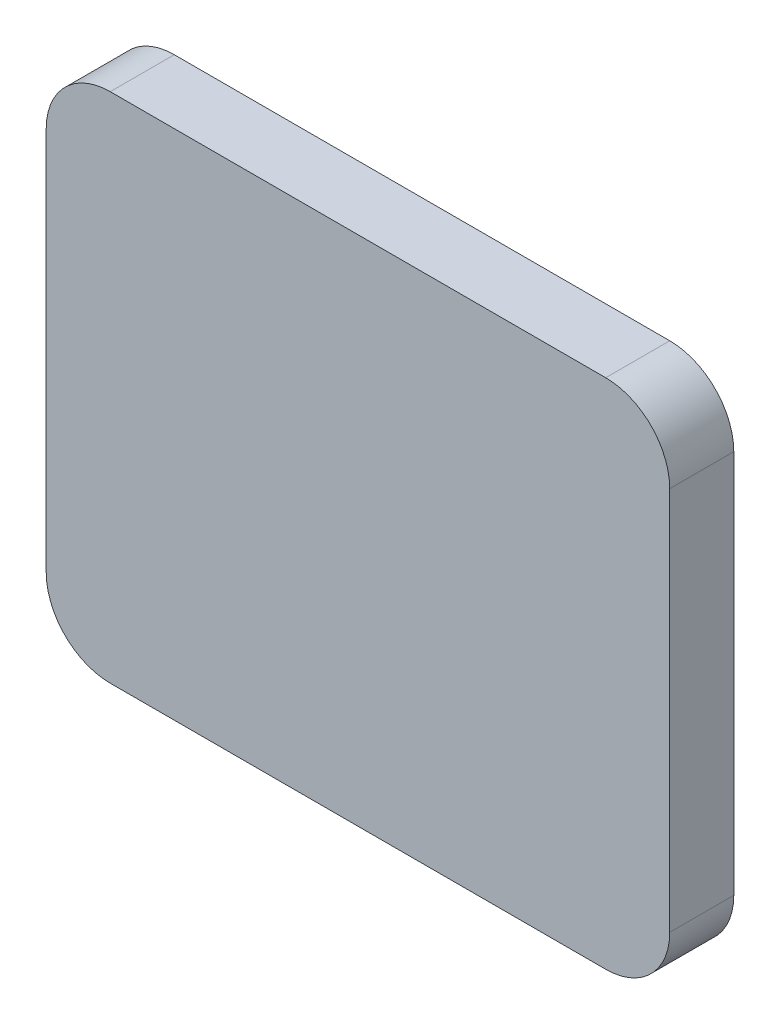
ISO-10303-21;
HEADER;
FILE_DESCRIPTION(('STEP AP214'),'2;1');
FILE_NAME('part.step','',(''),(''),'','','');
FILE_SCHEMA(('AUTOMOTIVE_DESIGN { 1 0 10303 214 1 1 1 1 }'));
ENDSEC;
DATA;
#1=APPLICATION_CONTEXT('core data for automotive mechanical design processes');
#2=APPLICATION_PROTOCOL_DEFINITION('international standard','automotive_design',2000,#1);
#3=PRODUCT_CONTEXT('',#1,'mechanical');
#4=PRODUCT('Part','Part','',(#3));
#5=PRODUCT_RELATED_PRODUCT_CATEGORY('part','',(#4));
#6=PRODUCT_DEFINITION_FORMATION('','',#4);
#7=PRODUCT_DEFINITION_CONTEXT('part definition',#1,'design');
#8=PRODUCT_DEFINITION('design','',#6,#7);
#9=PRODUCT_DEFINITION_SHAPE('','',#8);
#10=(LENGTH_UNIT() NAMED_UNIT(*) SI_UNIT(.MILLI.,.METRE.));
#11=(NAMED_UNIT(*) PLANE_ANGLE_UNIT() SI_UNIT($,.RADIAN.));
#12=(NAMED_UNIT(*) SI_UNIT($,.STERADIAN.) SOLID_ANGLE_UNIT());
#13=UNCERTAINTY_MEASURE_WITH_UNIT(LENGTH_MEASURE(1.E-05),#10,'distance_accuracy_value','');
#14=(GEOMETRIC_REPRESENTATION_CONTEXT(3) GLOBAL_UNCERTAINTY_ASSIGNED_CONTEXT((#13)) GLOBAL_UNIT_ASSIGNED_CONTEXT((#10,
#11,#12)) REPRESENTATION_CONTEXT('',''));
#15=CARTESIAN_POINT('',(0.,0.,0.));
#16=DIRECTION('',(0.,0.,1.));
#17=DIRECTION('',(1.,0.,0.));
#18=AXIS2_PLACEMENT_3D('',#15,#16,#17);
#19=CARTESIAN_POINT('',(79.5389734413024,-10.,47.8606367334853));
#20=DIRECTION('',(0.,0.,-1.));
#21=DIRECTION('',(-1.,0.,0.));
#22=AXIS2_PLACEMENT_3D('',#19,#20,#21);
#23=CYLINDRICAL_SURFACE('',#22,5.);
#24=DIRECTION('',(0.,0.,-1.));
#25=VECTOR('',#24,1.);
#26=CARTESIAN_POINT('',(74.5389734413024,-10.,47.8606367334853));
#27=LINE('',#26,#25);
#28=CARTESIAN_POINT('',(74.5389734413024,-10.,47.8606367334853));
#29=VERTEX_POINT('',#28);
#30=CARTESIAN_POINT('',(74.5389734413024,-10.,42.8606367334853));
#31=VERTEX_POINT('',#30);
#32=EDGE_CURVE('E158',#29,#31,#27,.T.);
#33=ORIENTED_EDGE('',*,*,#32,.F.);
#34=CARTESIAN_POINT('',(79.5389734413024,-10.,47.8606367334853));
#35=DIRECTION('',(0.,0.,1.));
#36=DIRECTION('',(1.,0.,0.));
#37=AXIS2_PLACEMENT_3D('',#34,#35,#36);
#38=CIRCLE('',#37,5.);
#39=CARTESIAN_POINT('',(79.5389734413024,-5.00000000000002,47.8606367334853));
#40=VERTEX_POINT('',#39);
#41=EDGE_CURVE('E49',#40,#29,#38,.T.);
#42=ORIENTED_EDGE('',*,*,#41,.F.);
#43=DIRECTION('',(0.,0.,-1.));
#44=VECTOR('',#43,1.);
#45=CARTESIAN_POINT('',(79.5389734413024,-5.00000000000002,47.8606367334853));
#46=LINE('',#45,#44);
#47=CARTESIAN_POINT('',(79.5389734413024,-5.00000000000002,42.8606367334853));
#48=VERTEX_POINT('',#47);
#49=EDGE_CURVE('E161',#48,#40,#46,.F.);
#50=ORIENTED_EDGE('',*,*,#49,.F.);
#51=CARTESIAN_POINT('',(79.5389734413024,-10.,42.8606367334853));
#52=DIRECTION('',(0.,0.,1.));
#53=DIRECTION('',(1.,0.,0.));
#54=AXIS2_PLACEMENT_3D('',#51,#52,#53);
#55=CIRCLE('',#54,5.);
#56=EDGE_CURVE('E11',#31,#48,#55,.F.);
#57=ORIENTED_EDGE('',*,*,#56,.F.);
#58=EDGE_LOOP('',(#33,#42,#50,#57));
#59=FACE_BOUND('',#58,.T.);
#60=ADVANCED_FACE('F42',(#59),#23,.T.);
#61=CARTESIAN_POINT('',(118.222876551902,-10.,47.8606367334853));
#62=DIRECTION('',(0.,0.,1.));
#63=DIRECTION('',(1.,0.,0.));
#64=AXIS2_PLACEMENT_3D('',#61,#62,#63);
#65=CYLINDRICAL_SURFACE('',#64,5.);
#66=DIRECTION('',(0.,0.,1.));
#67=VECTOR('',#66,1.);
#68=CARTESIAN_POINT('',(123.222876551902,-10.,47.8606367334853));
#69=LINE('',#68,#67);
#70=CARTESIAN_POINT('',(123.222876551902,-10.,42.8606367334853));
#71=VERTEX_POINT('',#70);
#72=CARTESIAN_POINT('',(123.222876551902,-10.,47.8606367334853));
#73=VERTEX_POINT('',#72);
#74=EDGE_CURVE('E148',#71,#73,#69,.T.);
#75=ORIENTED_EDGE('',*,*,#74,.F.);
#76=CARTESIAN_POINT('',(118.222876551902,-10.,42.8606367334853));
#77=DIRECTION('',(0.,0.,1.));
#78=DIRECTION('',(1.,0.,0.));
#79=AXIS2_PLACEMENT_3D('',#76,#77,#78);
#80=CIRCLE('',#79,5.);
#81=CARTESIAN_POINT('',(118.222876551902,-5.00000000000002,42.8606367334853));
#82=VERTEX_POINT('',#81);
#83=EDGE_CURVE('E154',#82,#71,#80,.F.);
#84=ORIENTED_EDGE('',*,*,#83,.F.);
#85=DIRECTION('',(0.,0.,1.));
#86=VECTOR('',#85,1.);
#87=CARTESIAN_POINT('',(118.222876551902,-5.00000000000002,47.8606367334853));
#88=LINE('',#87,#86);
#89=CARTESIAN_POINT('',(118.222876551902,-5.00000000000002,47.8606367334853));
#90=VERTEX_POINT('',#89);
#91=EDGE_CURVE('E151',#90,#82,#88,.F.);
#92=ORIENTED_EDGE('',*,*,#91,.F.);
#93=CARTESIAN_POINT('',(118.222876551902,-10.,47.8606367334853));
#94=DIRECTION('',(0.,0.,1.));
#95=DIRECTION('',(1.,0.,0.));
#96=AXIS2_PLACEMENT_3D('',#93,#94,#95);
#97=CIRCLE('',#96,5.);
#98=EDGE_CURVE('E156',#73,#90,#97,.T.);
#99=ORIENTED_EDGE('',*,*,#98,.F.);
#100=EDGE_LOOP('',(#75,#84,#92,#99));
#101=FACE_BOUND('',#100,.T.);
#102=ADVANCED_FACE('F182',(#101),#65,.T.);
#103=CARTESIAN_POINT('',(118.222876551902,-40.,47.8606367334853));
#104=DIRECTION('',(0.,0.,1.));
#105=DIRECTION('',(1.,0.,0.));
#106=AXIS2_PLACEMENT_3D('',#103,#104,#105);
#107=CYLINDRICAL_SURFACE('',#106,5.);
#108=DIRECTION('',(0.,0.,1.));
#109=VECTOR('',#108,1.);
#110=CARTESIAN_POINT('',(118.222876551902,-45.,47.8606367334853));
#111=LINE('',#110,#109);
#112=CARTESIAN_POINT('',(118.222876551902,-45.,42.8606367334853));
#113=VERTEX_POINT('',#112);
#114=CARTESIAN_POINT('',(118.222876551902,-45.,47.8606367334853));
#115=VERTEX_POINT('',#114);
#116=EDGE_CURVE('E114',#113,#115,#111,.T.);
#117=ORIENTED_EDGE('',*,*,#116,.F.);
#118=CARTESIAN_POINT('',(118.222876551902,-40.,42.8606367334853));
#119=DIRECTION('',(0.,0.,1.));
#120=DIRECTION('',(1.,0.,0.));
#121=AXIS2_PLACEMENT_3D('',#118,#119,#120);
#122=CIRCLE('',#121,5.);
#123=CARTESIAN_POINT('',(123.222876551902,-40.,42.8606367334853));
#124=VERTEX_POINT('',#123);
#125=EDGE_CURVE('E127',#124,#113,#122,.F.);
#126=ORIENTED_EDGE('',*,*,#125,.F.);
#127=DIRECTION('',(0.,0.,1.));
#128=VECTOR('',#127,1.);
#129=CARTESIAN_POINT('',(123.222876551902,-40.,47.8606367334853));
#130=LINE('',#129,#128);
#131=CARTESIAN_POINT('',(123.222876551902,-40.,47.8606367334853));
#132=VERTEX_POINT('',#131);
#133=EDGE_CURVE('E142',#132,#124,#130,.F.);
#134=ORIENTED_EDGE('',*,*,#133,.F.);
#135=CARTESIAN_POINT('',(118.222876551902,-40.,47.8606367334853));
#136=DIRECTION('',(0.,0.,1.));
#137=DIRECTION('',(1.,0.,0.));
#138=AXIS2_PLACEMENT_3D('',#135,#136,#137);
#139=CIRCLE('',#138,5.);
#140=EDGE_CURVE('E146',#115,#132,#139,.T.);
#141=ORIENTED_EDGE('',*,*,#140,.F.);
#142=EDGE_LOOP('',(#117,#126,#134,#141));
#143=FACE_BOUND('',#142,.T.);
#144=ADVANCED_FACE('F188',(#143),#107,.T.);
#145=CARTESIAN_POINT('',(79.5389734413024,-40.,47.8606367334853));
#146=DIRECTION('',(0.,0.,-1.));
#147=DIRECTION('',(-1.,0.,0.));
#148=AXIS2_PLACEMENT_3D('',#145,#146,#147);
#149=CYLINDRICAL_SURFACE('',#148,5.);
#150=DIRECTION('',(0.,0.,-1.));
#151=VECTOR('',#150,1.);
#152=CARTESIAN_POINT('',(79.5389734413024,-45.,47.8606367334853));
#153=LINE('',#152,#151);
#154=CARTESIAN_POINT('',(79.5389734413024,-45.,47.8606367334853));
#155=VERTEX_POINT('',#154);
#156=CARTESIAN_POINT('',(79.5389734413024,-45.,42.8606367334853));
#157=VERTEX_POINT('',#156);
#158=EDGE_CURVE('E109',#155,#157,#153,.T.);
#159=ORIENTED_EDGE('',*,*,#158,.F.);
#160=CARTESIAN_POINT('',(79.5389734413024,-40.,47.8606367334853));
#161=DIRECTION('',(0.,0.,1.));
#162=DIRECTION('',(1.,0.,0.));
#163=AXIS2_PLACEMENT_3D('',#160,#161,#162);
#164=CIRCLE('',#163,5.);
#165=CARTESIAN_POINT('',(74.5389734413024,-40.,47.8606367334853));
#166=VERTEX_POINT('',#165);
#167=EDGE_CURVE('E115',#166,#155,#164,.T.);
#168=ORIENTED_EDGE('',*,*,#167,.F.);
#169=DIRECTION('',(0.,0.,-1.));
#170=VECTOR('',#169,1.);
#171=CARTESIAN_POINT('',(74.5389734413024,-40.,47.8606367334853));
#172=LINE('',#171,#170);
#173=CARTESIAN_POINT('',(74.5389734413024,-40.,42.8606367334853));
#174=VERTEX_POINT('',#173);
#175=EDGE_CURVE('E112',#174,#166,#172,.F.);
#176=ORIENTED_EDGE('',*,*,#175,.F.);
#177=CARTESIAN_POINT('',(79.5389734413024,-40.,42.8606367334853));
#178=DIRECTION('',(0.,0.,1.));
#179=DIRECTION('',(1.,0.,0.));
#180=AXIS2_PLACEMENT_3D('',#177,#178,#179);
#181=CIRCLE('',#180,5.);
#182=EDGE_CURVE('E105',#157,#174,#181,.F.);
#183=ORIENTED_EDGE('',*,*,#182,.F.);
#184=EDGE_LOOP('',(#159,#168,#176,#183));
#185=FACE_BOUND('',#184,.T.);
#186=ADVANCED_FACE('F107',(#185),#149,.T.);
#187=CARTESIAN_POINT('',(123.222876551902,-5.00000000000002,47.8606367334853));
#188=DIRECTION('',(-1.,0.,0.));
#189=DIRECTION('',(0.,0.,1.));
#190=AXIS2_PLACEMENT_3D('',#187,#188,#189);
#191=PLANE('',#190);
#192=DIRECTION('',(0.,1.,0.));
#193=VECTOR('',#192,1.);
#194=CARTESIAN_POINT('',(123.222876551902,-5.00000000000002,42.8606367334853));
#195=LINE('',#194,#193);
#196=EDGE_CURVE('E174',#124,#71,#195,.T.);
#197=ORIENTED_EDGE('',*,*,#196,.T.);
#198=ORIENTED_EDGE('',*,*,#74,.T.);
#199=DIRECTION('',(0.,1.,0.));
#200=VECTOR('',#199,1.);
#201=CARTESIAN_POINT('',(123.222876551902,-5.00000000000002,47.8606367334853));
#202=LINE('',#201,#200);
#203=EDGE_CURVE('E129',#132,#73,#202,.T.);
#204=ORIENTED_EDGE('',*,*,#203,.F.);
#205=ORIENTED_EDGE('',*,*,#133,.T.);
#206=EDGE_LOOP('',(#197,#198,#204,#205));
#207=FACE_BOUND('',#206,.T.);
#208=ADVANCED_FACE('F185',(#207),#191,.F.);
#209=CARTESIAN_POINT('',(74.5389734413024,-5.00000000000002,47.8606367334853));
#210=DIRECTION('',(0.,-1.,0.));
#211=DIRECTION('',(0.,0.,-1.));
#212=AXIS2_PLACEMENT_3D('',#209,#210,#211);
#213=PLANE('',#212);
#214=DIRECTION('',(-1.,0.,0.));
#215=VECTOR('',#214,1.);
#216=CARTESIAN_POINT('',(74.5389734413024,-5.00000000000002,42.8606367334853));
#217=LINE('',#216,#215);
#218=EDGE_CURVE('E135',#82,#48,#217,.T.);
#219=ORIENTED_EDGE('',*,*,#218,.T.);
#220=ORIENTED_EDGE('',*,*,#49,.T.);
#221=DIRECTION('',(-1.,0.,0.));
#222=VECTOR('',#221,1.);
#223=CARTESIAN_POINT('',(74.5389734413024,-5.00000000000002,47.8606367334853));
#224=LINE('',#223,#222);
#225=EDGE_CURVE('E133',#90,#40,#224,.T.);
#226=ORIENTED_EDGE('',*,*,#225,.F.);
#227=ORIENTED_EDGE('',*,*,#91,.T.);
#228=EDGE_LOOP('',(#219,#220,#226,#227));
#229=FACE_BOUND('',#228,.T.);
#230=ADVANCED_FACE('F178',(#229),#213,.F.);
#231=CARTESIAN_POINT('',(74.5389734413024,-5.00000000000002,47.8606367334853));
#232=DIRECTION('',(1.,0.,0.));
#233=DIRECTION('',(0.,0.,-1.));
#234=AXIS2_PLACEMENT_3D('',#231,#232,#233);
#235=PLANE('',#234);
#236=DIRECTION('',(0.,-1.,0.));
#237=VECTOR('',#236,1.);
#238=CARTESIAN_POINT('',(74.5389734413024,-5.00000000000002,47.8606367334853));
#239=LINE('',#238,#237);
#240=EDGE_CURVE('E166',#29,#166,#239,.T.);
#241=ORIENTED_EDGE('',*,*,#240,.F.);
#242=ORIENTED_EDGE('',*,*,#32,.T.);
#243=DIRECTION('',(0.,-1.,0.));
#244=VECTOR('',#243,1.);
#245=CARTESIAN_POINT('',(74.5389734413024,-5.00000000000002,42.8606367334853));
#246=LINE('',#245,#244);
#247=EDGE_CURVE('E130',#31,#174,#246,.T.);
#248=ORIENTED_EDGE('',*,*,#247,.T.);
#249=ORIENTED_EDGE('',*,*,#175,.T.);
#250=EDGE_LOOP('',(#241,#242,#248,#249));
#251=FACE_BOUND('',#250,.T.);
#252=ADVANCED_FACE('F169',(#251),#235,.F.);
#253=CARTESIAN_POINT('',(74.5389734413024,-45.,47.8606367334853));
#254=DIRECTION('',(0.,1.,0.));
#255=DIRECTION('',(0.,0.,1.));
#256=AXIS2_PLACEMENT_3D('',#253,#254,#255);
#257=PLANE('',#256);
#258=DIRECTION('',(1.,0.,0.));
#259=VECTOR('',#258,1.);
#260=CARTESIAN_POINT('',(74.5389734413024,-45.,42.8606367334853));
#261=LINE('',#260,#259);
#262=EDGE_CURVE('E121',#157,#113,#261,.T.);
#263=ORIENTED_EDGE('',*,*,#262,.T.);
#264=ORIENTED_EDGE('',*,*,#116,.T.);
#265=DIRECTION('',(1.,0.,0.));
#266=VECTOR('',#265,1.);
#267=CARTESIAN_POINT('',(74.5389734413024,-45.,47.8606367334853));
#268=LINE('',#267,#266);
#269=EDGE_CURVE('E123',#155,#115,#268,.T.);
#270=ORIENTED_EDGE('',*,*,#269,.F.);
#271=ORIENTED_EDGE('',*,*,#158,.T.);
#272=EDGE_LOOP('',(#263,#264,#270,#271));
#273=FACE_BOUND('',#272,.T.);
#274=ADVANCED_FACE('F119',(#273),#257,.F.);
#275=CARTESIAN_POINT('',(0.,0.,47.8606367334853));
#276=DIRECTION('',(0.,0.,1.));
#277=DIRECTION('',(1.,0.,0.));
#278=AXIS2_PLACEMENT_3D('',#275,#276,#277);
#279=PLANE('',#278);
#280=ORIENTED_EDGE('',*,*,#225,.T.);
#281=ORIENTED_EDGE('',*,*,#41,.T.);
#282=ORIENTED_EDGE('',*,*,#240,.T.);
#283=ORIENTED_EDGE('',*,*,#167,.T.);
#284=ORIENTED_EDGE('',*,*,#269,.T.);
#285=ORIENTED_EDGE('',*,*,#140,.T.);
#286=ORIENTED_EDGE('',*,*,#203,.T.);
#287=ORIENTED_EDGE('',*,*,#98,.T.);
#288=EDGE_LOOP('',(#280,#281,#282,#283,#284,#285,#286,#287));
#289=FACE_BOUND('',#288,.T.);
#290=ADVANCED_FACE('F164',(#289),#279,.T.);
#291=CARTESIAN_POINT('',(0.,0.,42.8606367334853));
#292=DIRECTION('',(0.,0.,1.));
#293=DIRECTION('',(1.,0.,0.));
#294=AXIS2_PLACEMENT_3D('',#291,#292,#293);
#295=PLANE('',#294);
#296=ORIENTED_EDGE('',*,*,#247,.F.);
#297=ORIENTED_EDGE('',*,*,#56,.T.);
#298=ORIENTED_EDGE('',*,*,#218,.F.);
#299=ORIENTED_EDGE('',*,*,#83,.T.);
#300=ORIENTED_EDGE('',*,*,#196,.F.);
#301=ORIENTED_EDGE('',*,*,#125,.T.);
#302=ORIENTED_EDGE('',*,*,#262,.F.);
#303=ORIENTED_EDGE('',*,*,#182,.T.);
#304=EDGE_LOOP('',(#296,#297,#298,#299,#300,#301,#302,#303));
#305=FACE_BOUND('',#304,.T.);
#306=ADVANCED_FACE('F125',(#305),#295,.F.);
#307=CLOSED_SHELL('',(#60,#102,#144,#186,#208,#230,#252,#274,#290,#306));
#308=MANIFOLD_SOLID_BREP('B2',#307);
#309=ADVANCED_BREP_SHAPE_REPRESENTATION('',(#18,#308),#14);
#310=SHAPE_DEFINITION_REPRESENTATION(#9,#309);
ENDSEC;
END-ISO-10303-21;
